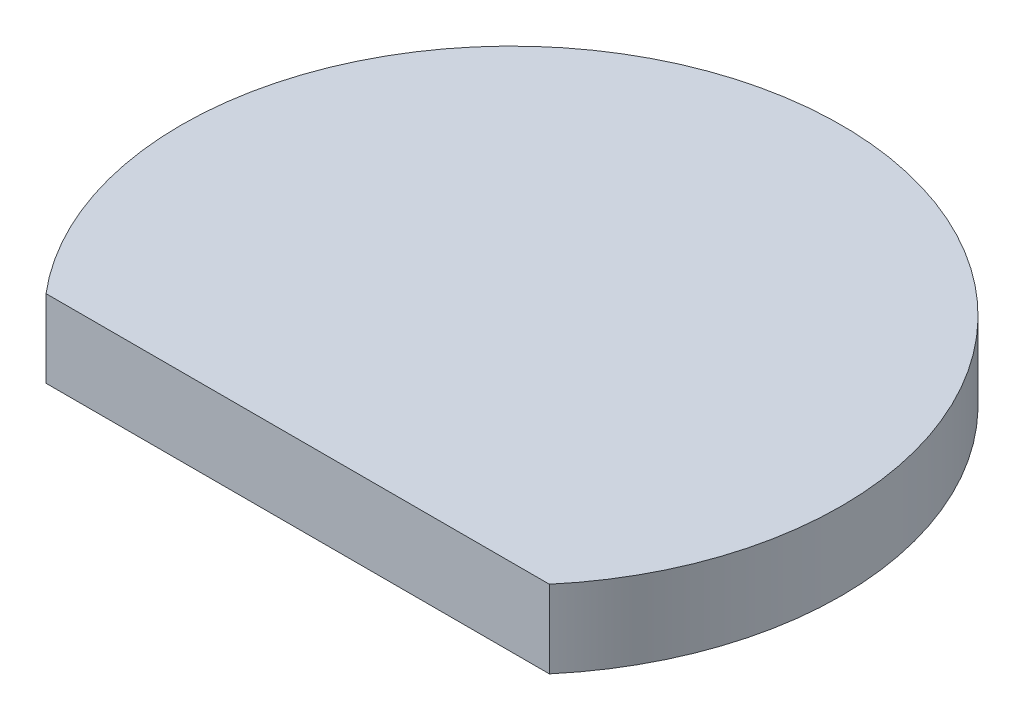
ISO-10303-21;
HEADER;
FILE_DESCRIPTION(('STEP AP214'),'2;1');
FILE_NAME('part.step','',(''),(''),'','','');
FILE_SCHEMA(('AUTOMOTIVE_DESIGN { 1 0 10303 214 1 1 1 1 }'));
ENDSEC;
DATA;
#1=APPLICATION_CONTEXT('core data for automotive mechanical design processes');
#2=APPLICATION_PROTOCOL_DEFINITION('international standard','automotive_design',2000,#1);
#3=PRODUCT_CONTEXT('',#1,'mechanical');
#4=PRODUCT('Part','Part','',(#3));
#5=PRODUCT_RELATED_PRODUCT_CATEGORY('part','',(#4));
#6=PRODUCT_DEFINITION_FORMATION('','',#4);
#7=PRODUCT_DEFINITION_CONTEXT('part definition',#1,'design');
#8=PRODUCT_DEFINITION('design','',#6,#7);
#9=PRODUCT_DEFINITION_SHAPE('','',#8);
#10=(LENGTH_UNIT() NAMED_UNIT(*) SI_UNIT(.MILLI.,.METRE.));
#11=(NAMED_UNIT(*) PLANE_ANGLE_UNIT() SI_UNIT($,.RADIAN.));
#12=(NAMED_UNIT(*) SI_UNIT($,.STERADIAN.) SOLID_ANGLE_UNIT());
#13=UNCERTAINTY_MEASURE_WITH_UNIT(LENGTH_MEASURE(1.E-05),#10,'distance_accuracy_value','');
#14=(GEOMETRIC_REPRESENTATION_CONTEXT(3) GLOBAL_UNCERTAINTY_ASSIGNED_CONTEXT((#13)) GLOBAL_UNIT_ASSIGNED_CONTEXT((#10,
#11,#12)) REPRESENTATION_CONTEXT('',''));
#15=CARTESIAN_POINT('',(0.,0.,0.));
#16=DIRECTION('',(0.,0.,1.));
#17=DIRECTION('',(1.,0.,0.));
#18=AXIS2_PLACEMENT_3D('',#15,#16,#17);
#19=CARTESIAN_POINT('',(0.,2.,0.));
#20=DIRECTION('',(0.,-1.,0.));
#21=DIRECTION('',(0.,0.,-1.));
#22=AXIS2_PLACEMENT_3D('',#19,#20,#21);
#23=CYLINDRICAL_SURFACE('',#22,8.5);
#24=CARTESIAN_POINT('',(0.,0.,0.));
#25=DIRECTION('',(0.,1.,0.));
#26=DIRECTION('',(0.,0.,1.));
#27=AXIS2_PLACEMENT_3D('',#24,#25,#26);
#28=CIRCLE('',#27,8.5);
#29=CARTESIAN_POINT('',(6.48074069840786,0.,5.5));
#30=VERTEX_POINT('',#29);
#31=CARTESIAN_POINT('',(-6.48074069840786,0.,5.5));
#32=VERTEX_POINT('',#31);
#33=EDGE_CURVE('E74',#30,#32,#28,.T.);
#34=ORIENTED_EDGE('',*,*,#33,.T.);
#35=DIRECTION('',(0.,-1.,0.));
#36=VECTOR('',#35,1.);
#37=CARTESIAN_POINT('',(-6.48074069840786,2.,5.5));
#38=LINE('',#37,#36);
#39=CARTESIAN_POINT('',(-6.48074069840786,2.,5.5));
#40=VERTEX_POINT('',#39);
#41=EDGE_CURVE('E11',#40,#32,#38,.T.);
#42=ORIENTED_EDGE('',*,*,#41,.F.);
#43=CARTESIAN_POINT('',(0.,2.,0.));
#44=DIRECTION('',(0.,1.,0.));
#45=DIRECTION('',(0.,0.,1.));
#46=AXIS2_PLACEMENT_3D('',#43,#44,#45);
#47=CIRCLE('',#46,8.5);
#48=CARTESIAN_POINT('',(6.48074069840786,2.,5.5));
#49=VERTEX_POINT('',#48);
#50=EDGE_CURVE('E73',#49,#40,#47,.T.);
#51=ORIENTED_EDGE('',*,*,#50,.F.);
#52=DIRECTION('',(0.,-1.,0.));
#53=VECTOR('',#52,1.);
#54=CARTESIAN_POINT('',(6.48074069840786,2.,5.5));
#55=LINE('',#54,#53);
#56=EDGE_CURVE('E51',#49,#30,#55,.T.);
#57=ORIENTED_EDGE('',*,*,#56,.T.);
#58=EDGE_LOOP('',(#34,#42,#51,#57));
#59=FACE_BOUND('',#58,.T.);
#60=ADVANCED_FACE('F43',(#59),#23,.T.);
#61=CARTESIAN_POINT('',(-6.48074069840786,2.,5.5));
#62=DIRECTION('',(0.,0.,-1.));
#63=DIRECTION('',(-1.,0.,0.));
#64=AXIS2_PLACEMENT_3D('',#61,#62,#63);
#65=PLANE('',#64);
#66=DIRECTION('',(1.,0.,0.));
#67=VECTOR('',#66,1.);
#68=CARTESIAN_POINT('',(-6.48074069840786,0.,5.5));
#69=LINE('',#68,#67);
#70=EDGE_CURVE('E66',#32,#30,#69,.T.);
#71=ORIENTED_EDGE('',*,*,#70,.T.);
#72=ORIENTED_EDGE('',*,*,#56,.F.);
#73=DIRECTION('',(1.,0.,0.));
#74=VECTOR('',#73,1.);
#75=CARTESIAN_POINT('',(-6.48074069840786,2.,5.5));
#76=LINE('',#75,#74);
#77=EDGE_CURVE('E58',#40,#49,#76,.T.);
#78=ORIENTED_EDGE('',*,*,#77,.F.);
#79=ORIENTED_EDGE('',*,*,#41,.T.);
#80=EDGE_LOOP('',(#71,#72,#78,#79));
#81=FACE_BOUND('',#80,.T.);
#82=ADVANCED_FACE('F69',(#81),#65,.F.);
#83=CARTESIAN_POINT('',(0.,2.,0.));
#84=DIRECTION('',(0.,1.,0.));
#85=DIRECTION('',(0.,0.,1.));
#86=AXIS2_PLACEMENT_3D('',#83,#84,#85);
#87=PLANE('',#86);
#88=ORIENTED_EDGE('',*,*,#50,.T.);
#89=ORIENTED_EDGE('',*,*,#77,.T.);
#90=EDGE_LOOP('',(#88,#89));
#91=FACE_BOUND('',#90,.T.);
#92=ADVANCED_FACE('F81',(#91),#87,.T.);
#93=CARTESIAN_POINT('',(0.,0.,0.));
#94=DIRECTION('',(0.,1.,0.));
#95=DIRECTION('',(0.,0.,1.));
#96=AXIS2_PLACEMENT_3D('',#93,#94,#95);
#97=PLANE('',#96);
#98=ORIENTED_EDGE('',*,*,#33,.F.);
#99=ORIENTED_EDGE('',*,*,#70,.F.);
#100=EDGE_LOOP('',(#98,#99));
#101=FACE_BOUND('',#100,.T.);
#102=ADVANCED_FACE('F77',(#101),#97,.F.);
#103=CLOSED_SHELL('',(#60,#82,#92,#102));
#104=MANIFOLD_SOLID_BREP('B2',#103);
#105=ADVANCED_BREP_SHAPE_REPRESENTATION('',(#18,#104),#14);
#106=SHAPE_DEFINITION_REPRESENTATION(#9,#105);
ENDSEC;
END-ISO-10303-21;
